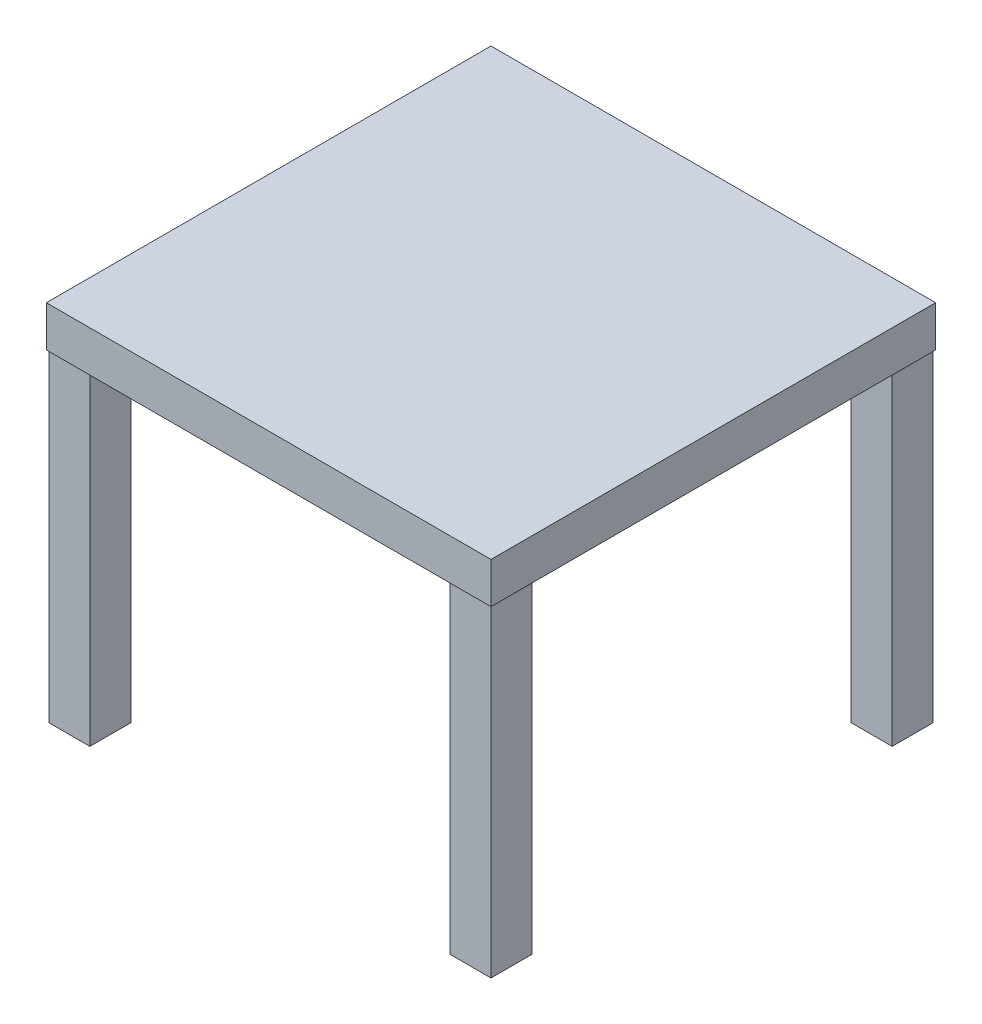
ISO-10303-21;
HEADER;
FILE_DESCRIPTION(('STEP AP214'),'2;1');
FILE_NAME('part.step','',(''),(''),'','','');
FILE_SCHEMA(('AUTOMOTIVE_DESIGN { 1 0 10303 214 1 1 1 1 }'));
ENDSEC;
DATA;
#1=APPLICATION_CONTEXT('core data for automotive mechanical design processes');
#2=APPLICATION_PROTOCOL_DEFINITION('international standard','automotive_design',2000,#1);
#3=PRODUCT_CONTEXT('',#1,'mechanical');
#4=PRODUCT('Part','Part','',(#3));
#5=PRODUCT_RELATED_PRODUCT_CATEGORY('part','',(#4));
#6=PRODUCT_DEFINITION_FORMATION('','',#4);
#7=PRODUCT_DEFINITION_CONTEXT('part definition',#1,'design');
#8=PRODUCT_DEFINITION('design','',#6,#7);
#9=PRODUCT_DEFINITION_SHAPE('','',#8);
#10=(LENGTH_UNIT() NAMED_UNIT(*) SI_UNIT(.MILLI.,.METRE.));
#11=(NAMED_UNIT(*) PLANE_ANGLE_UNIT() SI_UNIT($,.RADIAN.));
#12=(NAMED_UNIT(*) SI_UNIT($,.STERADIAN.) SOLID_ANGLE_UNIT());
#13=UNCERTAINTY_MEASURE_WITH_UNIT(LENGTH_MEASURE(1.E-05),#10,'distance_accuracy_value','');
#14=(GEOMETRIC_REPRESENTATION_CONTEXT(3) GLOBAL_UNCERTAINTY_ASSIGNED_CONTEXT((#13)) GLOBAL_UNIT_ASSIGNED_CONTEXT((#10,
#11,#12)) REPRESENTATION_CONTEXT('',''));
#15=CARTESIAN_POINT('',(0.,0.,0.));
#16=DIRECTION('',(0.,0.,1.));
#17=DIRECTION('',(1.,0.,0.));
#18=AXIS2_PLACEMENT_3D('',#15,#16,#17);
#19=CARTESIAN_POINT('',(0.,0.,0.));
#20=DIRECTION('',(0.,1.,0.));
#21=DIRECTION('',(0.,0.,1.));
#22=AXIS2_PLACEMENT_3D('',#19,#20,#21);
#23=PLANE('',#22);
#24=DIRECTION('',(0.,0.,-1.));
#25=VECTOR('',#24,1.);
#26=CARTESIAN_POINT('',(-273.4,0.,273.400000000001));
#27=LINE('',#26,#25);
#28=CARTESIAN_POINT('',(-273.4,0.,273.400000000001));
#29=VERTEX_POINT('',#28);
#30=CARTESIAN_POINT('',(-273.4,0.,222.800000000001));
#31=VERTEX_POINT('',#30);
#32=EDGE_CURVE('E191',#29,#31,#27,.T.);
#33=ORIENTED_EDGE('',*,*,#32,.F.);
#34=DIRECTION('',(-1.,0.,0.));
#35=VECTOR('',#34,1.);
#36=CARTESIAN_POINT('',(-273.4,0.,273.400000000001));
#37=LINE('',#36,#35);
#38=CARTESIAN_POINT('',(-222.8,0.,273.400000000001));
#39=VERTEX_POINT('',#38);
#40=EDGE_CURVE('E204',#39,#29,#37,.T.);
#41=ORIENTED_EDGE('',*,*,#40,.F.);
#42=DIRECTION('',(0.,0.,1.));
#43=VECTOR('',#42,1.);
#44=CARTESIAN_POINT('',(-222.8,0.,273.400000000001));
#45=LINE('',#44,#43);
#46=CARTESIAN_POINT('',(-222.8,0.,222.800000000001));
#47=VERTEX_POINT('',#46);
#48=EDGE_CURVE('E213',#47,#39,#45,.T.);
#49=ORIENTED_EDGE('',*,*,#48,.F.);
#50=DIRECTION('',(1.,0.,0.));
#51=VECTOR('',#50,1.);
#52=CARTESIAN_POINT('',(-273.4,0.,222.800000000001));
#53=LINE('',#52,#51);
#54=EDGE_CURVE('E194',#31,#47,#53,.T.);
#55=ORIENTED_EDGE('',*,*,#54,.F.);
#56=EDGE_LOOP('',(#33,#41,#49,#55));
#57=FACE_BOUND('',#56,.T.);
#58=DIRECTION('',(0.,0.,1.));
#59=VECTOR('',#58,1.);
#60=CARTESIAN_POINT('',(273.4,0.,-273.4));
#61=LINE('',#60,#59);
#62=CARTESIAN_POINT('',(273.4,0.,-273.4));
#63=VERTEX_POINT('',#62);
#64=CARTESIAN_POINT('',(273.4,0.,-222.8));
#65=VERTEX_POINT('',#64);
#66=EDGE_CURVE('E262',#63,#65,#61,.T.);
#67=ORIENTED_EDGE('',*,*,#66,.F.);
#68=DIRECTION('',(1.,0.,0.));
#69=VECTOR('',#68,1.);
#70=CARTESIAN_POINT('',(273.4,0.,-273.4));
#71=LINE('',#70,#69);
#72=CARTESIAN_POINT('',(222.8,0.,-273.4));
#73=VERTEX_POINT('',#72);
#74=EDGE_CURVE('E267',#73,#63,#71,.T.);
#75=ORIENTED_EDGE('',*,*,#74,.F.);
#76=DIRECTION('',(0.,0.,-1.));
#77=VECTOR('',#76,1.);
#78=CARTESIAN_POINT('',(222.8,0.,-273.4));
#79=LINE('',#78,#77);
#80=CARTESIAN_POINT('',(222.8,0.,-222.8));
#81=VERTEX_POINT('',#80);
#82=EDGE_CURVE('E279',#81,#73,#79,.T.);
#83=ORIENTED_EDGE('',*,*,#82,.F.);
#84=DIRECTION('',(-1.,0.,0.));
#85=VECTOR('',#84,1.);
#86=CARTESIAN_POINT('',(273.4,0.,-222.8));
#87=LINE('',#86,#85);
#88=EDGE_CURVE('E276',#65,#81,#87,.T.);
#89=ORIENTED_EDGE('',*,*,#88,.F.);
#90=EDGE_LOOP('',(#67,#75,#83,#89));
#91=FACE_BOUND('',#90,.T.);
#92=DIRECTION('',(0.,0.,1.));
#93=VECTOR('',#92,1.);
#94=CARTESIAN_POINT('',(-275.,0.,-275.));
#95=LINE('',#94,#93);
#96=CARTESIAN_POINT('',(-275.,0.,-275.));
#97=VERTEX_POINT('',#96);
#98=CARTESIAN_POINT('',(-275.,0.,275.000000000001));
#99=VERTEX_POINT('',#98);
#100=EDGE_CURVE('E295',#97,#99,#95,.T.);
#101=ORIENTED_EDGE('',*,*,#100,.F.);
#102=DIRECTION('',(-1.,0.,0.));
#103=VECTOR('',#102,1.);
#104=CARTESIAN_POINT('',(-275.,0.,-275.));
#105=LINE('',#104,#103);
#106=CARTESIAN_POINT('',(275.,0.,-275.));
#107=VERTEX_POINT('',#106);
#108=EDGE_CURVE('E300',#107,#97,#105,.T.);
#109=ORIENTED_EDGE('',*,*,#108,.F.);
#110=DIRECTION('',(0.,0.,-1.));
#111=VECTOR('',#110,1.);
#112=CARTESIAN_POINT('',(275.,0.,-275.));
#113=LINE('',#112,#111);
#114=CARTESIAN_POINT('',(275.,0.,275.000000000001));
#115=VERTEX_POINT('',#114);
#116=EDGE_CURVE('E311',#115,#107,#113,.T.);
#117=ORIENTED_EDGE('',*,*,#116,.F.);
#118=DIRECTION('',(1.,0.,0.));
#119=VECTOR('',#118,1.);
#120=CARTESIAN_POINT('',(-275.,0.,275.000000000001));
#121=LINE('',#120,#119);
#122=EDGE_CURVE('E309',#99,#115,#121,.T.);
#123=ORIENTED_EDGE('',*,*,#122,.F.);
#124=EDGE_LOOP('',(#101,#109,#117,#123));
#125=FACE_BOUND('',#124,.T.);
#126=DIRECTION('',(0.,0.,-1.));
#127=VECTOR('',#126,1.);
#128=CARTESIAN_POINT('',(-273.4,0.,-273.4));
#129=LINE('',#128,#127);
#130=CARTESIAN_POINT('',(-273.4,0.,-222.8));
#131=VERTEX_POINT('',#130);
#132=CARTESIAN_POINT('',(-273.4,0.,-273.4));
#133=VERTEX_POINT('',#132);
#134=EDGE_CURVE('E229',#131,#133,#129,.T.);
#135=ORIENTED_EDGE('',*,*,#134,.F.);
#136=DIRECTION('',(-1.,0.,0.));
#137=VECTOR('',#136,1.);
#138=CARTESIAN_POINT('',(-273.4,0.,-222.8));
#139=LINE('',#138,#137);
#140=CARTESIAN_POINT('',(-222.8,0.,-222.8));
#141=VERTEX_POINT('',#140);
#142=EDGE_CURVE('E234',#141,#131,#139,.T.);
#143=ORIENTED_EDGE('',*,*,#142,.F.);
#144=DIRECTION('',(0.,0.,1.));
#145=VECTOR('',#144,1.);
#146=CARTESIAN_POINT('',(-222.8,0.,-273.4));
#147=LINE('',#146,#145);
#148=CARTESIAN_POINT('',(-222.8,0.,-273.4));
#149=VERTEX_POINT('',#148);
#150=EDGE_CURVE('E246',#149,#141,#147,.T.);
#151=ORIENTED_EDGE('',*,*,#150,.F.);
#152=DIRECTION('',(1.,0.,0.));
#153=VECTOR('',#152,1.);
#154=CARTESIAN_POINT('',(-273.4,0.,-273.4));
#155=LINE('',#154,#153);
#156=EDGE_CURVE('E243',#133,#149,#155,.T.);
#157=ORIENTED_EDGE('',*,*,#156,.F.);
#158=EDGE_LOOP('',(#135,#143,#151,#157));
#159=FACE_BOUND('',#158,.T.);
#160=DIRECTION('',(0.,0.,-1.));
#161=VECTOR('',#160,1.);
#162=CARTESIAN_POINT('',(222.8,0.,222.800000000001));
#163=LINE('',#162,#161);
#164=CARTESIAN_POINT('',(222.8,0.,273.400000000001));
#165=VERTEX_POINT('',#164);
#166=CARTESIAN_POINT('',(222.8,0.,222.800000000001));
#167=VERTEX_POINT('',#166);
#168=EDGE_CURVE('E190',#165,#167,#163,.T.);
#169=ORIENTED_EDGE('',*,*,#168,.F.);
#170=DIRECTION('',(-1.,0.,0.));
#171=VECTOR('',#170,1.);
#172=CARTESIAN_POINT('',(222.8,0.,273.400000000001));
#173=LINE('',#172,#171);
#174=CARTESIAN_POINT('',(273.4,0.,273.400000000001));
#175=VERTEX_POINT('',#174);
#176=EDGE_CURVE('E187',#175,#165,#173,.T.);
#177=ORIENTED_EDGE('',*,*,#176,.F.);
#178=DIRECTION('',(0.,0.,1.));
#179=VECTOR('',#178,1.);
#180=CARTESIAN_POINT('',(273.4,0.,222.800000000001));
#181=LINE('',#180,#179);
#182=CARTESIAN_POINT('',(273.4,0.,222.800000000001));
#183=VERTEX_POINT('',#182);
#184=EDGE_CURVE('E53',#183,#175,#181,.T.);
#185=ORIENTED_EDGE('',*,*,#184,.F.);
#186=DIRECTION('',(1.,0.,0.));
#187=VECTOR('',#186,1.);
#188=CARTESIAN_POINT('',(222.8,0.,222.800000000001));
#189=LINE('',#188,#187);
#190=EDGE_CURVE('E48',#167,#183,#189,.T.);
#191=ORIENTED_EDGE('',*,*,#190,.F.);
#192=EDGE_LOOP('',(#169,#177,#185,#191));
#193=FACE_BOUND('',#192,.T.);
#194=ADVANCED_FACE('F33',(#57,#91,#125,#159,#193),#23,.F.);
#195=CARTESIAN_POINT('',(-275.,50.6,-275.));
#196=DIRECTION('',(1.,0.,0.));
#197=DIRECTION('',(0.,0.,-1.));
#198=AXIS2_PLACEMENT_3D('',#195,#196,#197);
#199=PLANE('',#198);
#200=ORIENTED_EDGE('',*,*,#100,.T.);
#201=DIRECTION('',(0.,-1.,0.));
#202=VECTOR('',#201,1.);
#203=CARTESIAN_POINT('',(-275.,50.6,275.000000000001));
#204=LINE('',#203,#202);
#205=CARTESIAN_POINT('',(-275.,50.6,275.000000000001));
#206=VERTEX_POINT('',#205);
#207=EDGE_CURVE('E11',#206,#99,#204,.T.);
#208=ORIENTED_EDGE('',*,*,#207,.F.);
#209=DIRECTION('',(0.,0.,1.));
#210=VECTOR('',#209,1.);
#211=CARTESIAN_POINT('',(-275.,50.6,-275.));
#212=LINE('',#211,#210);
#213=CARTESIAN_POINT('',(-275.,50.6,-275.));
#214=VERTEX_POINT('',#213);
#215=EDGE_CURVE('E296',#214,#206,#212,.T.);
#216=ORIENTED_EDGE('',*,*,#215,.F.);
#217=DIRECTION('',(0.,-1.,0.));
#218=VECTOR('',#217,1.);
#219=CARTESIAN_POINT('',(-275.,50.6,-275.));
#220=LINE('',#219,#218);
#221=EDGE_CURVE('E306',#214,#97,#220,.T.);
#222=ORIENTED_EDGE('',*,*,#221,.T.);
#223=EDGE_LOOP('',(#200,#208,#216,#222));
#224=FACE_BOUND('',#223,.T.);
#225=ADVANCED_FACE('F35',(#224),#199,.F.);
#226=CARTESIAN_POINT('',(-275.,50.6,275.000000000001));
#227=DIRECTION('',(0.,0.,-1.));
#228=DIRECTION('',(-1.,0.,0.));
#229=AXIS2_PLACEMENT_3D('',#226,#227,#228);
#230=PLANE('',#229);
#231=ORIENTED_EDGE('',*,*,#122,.T.);
#232=DIRECTION('',(0.,-1.,0.));
#233=VECTOR('',#232,1.);
#234=CARTESIAN_POINT('',(275.,50.6,275.000000000001));
#235=LINE('',#234,#233);
#236=CARTESIAN_POINT('',(275.,50.6,275.000000000001));
#237=VERTEX_POINT('',#236);
#238=EDGE_CURVE('E41',#237,#115,#235,.T.);
#239=ORIENTED_EDGE('',*,*,#238,.F.);
#240=DIRECTION('',(1.,0.,0.));
#241=VECTOR('',#240,1.);
#242=CARTESIAN_POINT('',(-275.,50.6,275.000000000001));
#243=LINE('',#242,#241);
#244=EDGE_CURVE('E299',#206,#237,#243,.T.);
#245=ORIENTED_EDGE('',*,*,#244,.F.);
#246=ORIENTED_EDGE('',*,*,#207,.T.);
#247=EDGE_LOOP('',(#231,#239,#245,#246));
#248=FACE_BOUND('',#247,.T.);
#249=ADVANCED_FACE('F339',(#248),#230,.F.);
#250=CARTESIAN_POINT('',(275.,50.6,-275.));
#251=DIRECTION('',(-1.,0.,0.));
#252=DIRECTION('',(0.,0.,1.));
#253=AXIS2_PLACEMENT_3D('',#250,#251,#252);
#254=PLANE('',#253);
#255=ORIENTED_EDGE('',*,*,#116,.T.);
#256=DIRECTION('',(0.,-1.,0.));
#257=VECTOR('',#256,1.);
#258=CARTESIAN_POINT('',(275.,50.6,-275.));
#259=LINE('',#258,#257);
#260=CARTESIAN_POINT('',(275.,50.6,-275.));
#261=VERTEX_POINT('',#260);
#262=EDGE_CURVE('E316',#261,#107,#259,.T.);
#263=ORIENTED_EDGE('',*,*,#262,.F.);
#264=DIRECTION('',(0.,0.,-1.));
#265=VECTOR('',#264,1.);
#266=CARTESIAN_POINT('',(275.,50.6,-275.));
#267=LINE('',#266,#265);
#268=EDGE_CURVE('E302',#237,#261,#267,.T.);
#269=ORIENTED_EDGE('',*,*,#268,.F.);
#270=ORIENTED_EDGE('',*,*,#238,.T.);
#271=EDGE_LOOP('',(#255,#263,#269,#270));
#272=FACE_BOUND('',#271,.T.);
#273=ADVANCED_FACE('F323',(#272),#254,.F.);
#274=CARTESIAN_POINT('',(-275.,50.6,-275.));
#275=DIRECTION('',(0.,0.,1.));
#276=DIRECTION('',(1.,0.,0.));
#277=AXIS2_PLACEMENT_3D('',#274,#275,#276);
#278=PLANE('',#277);
#279=ORIENTED_EDGE('',*,*,#108,.T.);
#280=ORIENTED_EDGE('',*,*,#221,.F.);
#281=DIRECTION('',(-1.,0.,0.));
#282=VECTOR('',#281,1.);
#283=CARTESIAN_POINT('',(-275.,50.6,-275.));
#284=LINE('',#283,#282);
#285=EDGE_CURVE('E304',#261,#214,#284,.T.);
#286=ORIENTED_EDGE('',*,*,#285,.F.);
#287=ORIENTED_EDGE('',*,*,#262,.T.);
#288=EDGE_LOOP('',(#279,#280,#286,#287));
#289=FACE_BOUND('',#288,.T.);
#290=ADVANCED_FACE('F332',(#289),#278,.F.);
#291=CARTESIAN_POINT('',(0.,50.6,0.));
#292=DIRECTION('',(0.,1.,0.));
#293=DIRECTION('',(0.,0.,1.));
#294=AXIS2_PLACEMENT_3D('',#291,#292,#293);
#295=PLANE('',#294);
#296=ORIENTED_EDGE('',*,*,#215,.T.);
#297=ORIENTED_EDGE('',*,*,#244,.T.);
#298=ORIENTED_EDGE('',*,*,#268,.T.);
#299=ORIENTED_EDGE('',*,*,#285,.T.);
#300=EDGE_LOOP('',(#296,#297,#298,#299));
#301=FACE_BOUND('',#300,.T.);
#302=ADVANCED_FACE('F338',(#301),#295,.T.);
#303=CARTESIAN_POINT('',(273.4,-399.4,-273.4));
#304=DIRECTION('',(-1.,0.,0.));
#305=DIRECTION('',(0.,0.,1.));
#306=AXIS2_PLACEMENT_3D('',#303,#304,#305);
#307=PLANE('',#306);
#308=ORIENTED_EDGE('',*,*,#66,.T.);
#309=DIRECTION('',(0.,1.,0.));
#310=VECTOR('',#309,1.);
#311=CARTESIAN_POINT('',(273.4,-399.4,-222.8));
#312=LINE('',#311,#310);
#313=CARTESIAN_POINT('',(273.4,-399.4,-222.8));
#314=VERTEX_POINT('',#313);
#315=EDGE_CURVE('E292',#314,#65,#312,.T.);
#316=ORIENTED_EDGE('',*,*,#315,.F.);
#317=DIRECTION('',(0.,0.,1.));
#318=VECTOR('',#317,1.);
#319=CARTESIAN_POINT('',(273.4,-399.4,-273.4));
#320=LINE('',#319,#318);
#321=CARTESIAN_POINT('',(273.4,-399.4,-273.4));
#322=VERTEX_POINT('',#321);
#323=EDGE_CURVE('E263',#322,#314,#320,.T.);
#324=ORIENTED_EDGE('',*,*,#323,.F.);
#325=DIRECTION('',(0.,1.,0.));
#326=VECTOR('',#325,1.);
#327=CARTESIAN_POINT('',(273.4,-399.4,-273.4));
#328=LINE('',#327,#326);
#329=EDGE_CURVE('E273',#322,#63,#328,.T.);
#330=ORIENTED_EDGE('',*,*,#329,.T.);
#331=EDGE_LOOP('',(#308,#316,#324,#330));
#332=FACE_BOUND('',#331,.T.);
#333=ADVANCED_FACE('F359',(#332),#307,.F.);
#334=CARTESIAN_POINT('',(273.4,-399.4,-222.8));
#335=DIRECTION('',(0.,0.,-1.));
#336=DIRECTION('',(-1.,0.,0.));
#337=AXIS2_PLACEMENT_3D('',#334,#335,#336);
#338=PLANE('',#337);
#339=ORIENTED_EDGE('',*,*,#88,.T.);
#340=DIRECTION('',(0.,1.,0.));
#341=VECTOR('',#340,1.);
#342=CARTESIAN_POINT('',(222.8,-399.4,-222.8));
#343=LINE('',#342,#341);
#344=CARTESIAN_POINT('',(222.8,-399.4,-222.8));
#345=VERTEX_POINT('',#344);
#346=EDGE_CURVE('E289',#345,#81,#343,.T.);
#347=ORIENTED_EDGE('',*,*,#346,.F.);
#348=DIRECTION('',(-1.,0.,0.));
#349=VECTOR('',#348,1.);
#350=CARTESIAN_POINT('',(273.4,-399.4,-222.8));
#351=LINE('',#350,#349);
#352=EDGE_CURVE('E266',#314,#345,#351,.T.);
#353=ORIENTED_EDGE('',*,*,#352,.F.);
#354=ORIENTED_EDGE('',*,*,#315,.T.);
#355=EDGE_LOOP('',(#339,#347,#353,#354));
#356=FACE_BOUND('',#355,.T.);
#357=ADVANCED_FACE('F363',(#356),#338,.F.);
#358=CARTESIAN_POINT('',(222.8,-399.4,-273.4));
#359=DIRECTION('',(1.,0.,0.));
#360=DIRECTION('',(0.,0.,-1.));
#361=AXIS2_PLACEMENT_3D('',#358,#359,#360);
#362=PLANE('',#361);
#363=ORIENTED_EDGE('',*,*,#82,.T.);
#364=DIRECTION('',(0.,1.,0.));
#365=VECTOR('',#364,1.);
#366=CARTESIAN_POINT('',(222.8,-399.4,-273.4));
#367=LINE('',#366,#365);
#368=CARTESIAN_POINT('',(222.8,-399.4,-273.4));
#369=VERTEX_POINT('',#368);
#370=EDGE_CURVE('E286',#369,#73,#367,.T.);
#371=ORIENTED_EDGE('',*,*,#370,.F.);
#372=DIRECTION('',(0.,0.,-1.));
#373=VECTOR('',#372,1.);
#374=CARTESIAN_POINT('',(222.8,-399.4,-273.4));
#375=LINE('',#374,#373);
#376=EDGE_CURVE('E269',#345,#369,#375,.T.);
#377=ORIENTED_EDGE('',*,*,#376,.F.);
#378=ORIENTED_EDGE('',*,*,#346,.T.);
#379=EDGE_LOOP('',(#363,#371,#377,#378));
#380=FACE_BOUND('',#379,.T.);
#381=ADVANCED_FACE('F368',(#380),#362,.F.);
#382=CARTESIAN_POINT('',(273.4,-399.4,-273.4));
#383=DIRECTION('',(0.,0.,1.));
#384=DIRECTION('',(1.,0.,0.));
#385=AXIS2_PLACEMENT_3D('',#382,#383,#384);
#386=PLANE('',#385);
#387=ORIENTED_EDGE('',*,*,#74,.T.);
#388=ORIENTED_EDGE('',*,*,#329,.F.);
#389=DIRECTION('',(1.,0.,0.));
#390=VECTOR('',#389,1.);
#391=CARTESIAN_POINT('',(273.4,-399.4,-273.4));
#392=LINE('',#391,#390);
#393=EDGE_CURVE('E271',#369,#322,#392,.T.);
#394=ORIENTED_EDGE('',*,*,#393,.F.);
#395=ORIENTED_EDGE('',*,*,#370,.T.);
#396=EDGE_LOOP('',(#387,#388,#394,#395));
#397=FACE_BOUND('',#396,.T.);
#398=ADVANCED_FACE('F374',(#397),#386,.F.);
#399=CARTESIAN_POINT('',(0.,-399.4,0.));
#400=DIRECTION('',(0.,-1.,0.));
#401=DIRECTION('',(0.,0.,-1.));
#402=AXIS2_PLACEMENT_3D('',#399,#400,#401);
#403=PLANE('',#402);
#404=ORIENTED_EDGE('',*,*,#323,.T.);
#405=ORIENTED_EDGE('',*,*,#352,.T.);
#406=ORIENTED_EDGE('',*,*,#376,.T.);
#407=ORIENTED_EDGE('',*,*,#393,.T.);
#408=EDGE_LOOP('',(#404,#405,#406,#407));
#409=FACE_BOUND('',#408,.T.);
#410=ADVANCED_FACE('F378',(#409),#403,.T.);
#411=CARTESIAN_POINT('',(-273.4,-399.4,-273.4));
#412=DIRECTION('',(1.,0.,0.));
#413=DIRECTION('',(0.,0.,-1.));
#414=AXIS2_PLACEMENT_3D('',#411,#412,#413);
#415=PLANE('',#414);
#416=ORIENTED_EDGE('',*,*,#134,.T.);
#417=DIRECTION('',(0.,1.,0.));
#418=VECTOR('',#417,1.);
#419=CARTESIAN_POINT('',(-273.4,-399.4,-273.4));
#420=LINE('',#419,#418);
#421=CARTESIAN_POINT('',(-273.4,-399.4,-273.4));
#422=VERTEX_POINT('',#421);
#423=EDGE_CURVE('E259',#422,#133,#420,.T.);
#424=ORIENTED_EDGE('',*,*,#423,.F.);
#425=DIRECTION('',(0.,0.,-1.));
#426=VECTOR('',#425,1.);
#427=CARTESIAN_POINT('',(-273.4,-399.4,-273.4));
#428=LINE('',#427,#426);
#429=CARTESIAN_POINT('',(-273.4,-399.4,-222.8));
#430=VERTEX_POINT('',#429);
#431=EDGE_CURVE('E230',#430,#422,#428,.T.);
#432=ORIENTED_EDGE('',*,*,#431,.F.);
#433=DIRECTION('',(0.,1.,0.));
#434=VECTOR('',#433,1.);
#435=CARTESIAN_POINT('',(-273.4,-399.4,-222.8));
#436=LINE('',#435,#434);
#437=EDGE_CURVE('E240',#430,#131,#436,.T.);
#438=ORIENTED_EDGE('',*,*,#437,.T.);
#439=EDGE_LOOP('',(#416,#424,#432,#438));
#440=FACE_BOUND('',#439,.T.);
#441=ADVANCED_FACE('F382',(#440),#415,.F.);
#442=CARTESIAN_POINT('',(-273.4,-399.4,-273.4));
#443=DIRECTION('',(0.,0.,1.));
#444=DIRECTION('',(1.,0.,0.));
#445=AXIS2_PLACEMENT_3D('',#442,#443,#444);
#446=PLANE('',#445);
#447=ORIENTED_EDGE('',*,*,#156,.T.);
#448=DIRECTION('',(0.,1.,0.));
#449=VECTOR('',#448,1.);
#450=CARTESIAN_POINT('',(-222.8,-399.4,-273.4));
#451=LINE('',#450,#449);
#452=CARTESIAN_POINT('',(-222.8,-399.4,-273.4));
#453=VERTEX_POINT('',#452);
#454=EDGE_CURVE('E256',#453,#149,#451,.T.);
#455=ORIENTED_EDGE('',*,*,#454,.F.);
#456=DIRECTION('',(1.,0.,0.));
#457=VECTOR('',#456,1.);
#458=CARTESIAN_POINT('',(-273.4,-399.4,-273.4));
#459=LINE('',#458,#457);
#460=EDGE_CURVE('E233',#422,#453,#459,.T.);
#461=ORIENTED_EDGE('',*,*,#460,.F.);
#462=ORIENTED_EDGE('',*,*,#423,.T.);
#463=EDGE_LOOP('',(#447,#455,#461,#462));
#464=FACE_BOUND('',#463,.T.);
#465=ADVANCED_FACE('F386',(#464),#446,.F.);
#466=CARTESIAN_POINT('',(-222.8,-399.4,-273.4));
#467=DIRECTION('',(-1.,0.,0.));
#468=DIRECTION('',(0.,0.,1.));
#469=AXIS2_PLACEMENT_3D('',#466,#467,#468);
#470=PLANE('',#469);
#471=ORIENTED_EDGE('',*,*,#150,.T.);
#472=DIRECTION('',(0.,1.,0.));
#473=VECTOR('',#472,1.);
#474=CARTESIAN_POINT('',(-222.8,-399.4,-222.8));
#475=LINE('',#474,#473);
#476=CARTESIAN_POINT('',(-222.8,-399.4,-222.8));
#477=VERTEX_POINT('',#476);
#478=EDGE_CURVE('E253',#477,#141,#475,.T.);
#479=ORIENTED_EDGE('',*,*,#478,.F.);
#480=DIRECTION('',(0.,0.,1.));
#481=VECTOR('',#480,1.);
#482=CARTESIAN_POINT('',(-222.8,-399.4,-273.4));
#483=LINE('',#482,#481);
#484=EDGE_CURVE('E236',#453,#477,#483,.T.);
#485=ORIENTED_EDGE('',*,*,#484,.F.);
#486=ORIENTED_EDGE('',*,*,#454,.T.);
#487=EDGE_LOOP('',(#471,#479,#485,#486));
#488=FACE_BOUND('',#487,.T.);
#489=ADVANCED_FACE('F390',(#488),#470,.F.);
#490=CARTESIAN_POINT('',(-273.4,-399.4,-222.8));
#491=DIRECTION('',(0.,0.,-1.));
#492=DIRECTION('',(-1.,0.,0.));
#493=AXIS2_PLACEMENT_3D('',#490,#491,#492);
#494=PLANE('',#493);
#495=ORIENTED_EDGE('',*,*,#142,.T.);
#496=ORIENTED_EDGE('',*,*,#437,.F.);
#497=DIRECTION('',(-1.,0.,0.));
#498=VECTOR('',#497,1.);
#499=CARTESIAN_POINT('',(-273.4,-399.4,-222.8));
#500=LINE('',#499,#498);
#501=EDGE_CURVE('E238',#477,#430,#500,.T.);
#502=ORIENTED_EDGE('',*,*,#501,.F.);
#503=ORIENTED_EDGE('',*,*,#478,.T.);
#504=EDGE_LOOP('',(#495,#496,#502,#503));
#505=FACE_BOUND('',#504,.T.);
#506=ADVANCED_FACE('F394',(#505),#494,.F.);
#507=CARTESIAN_POINT('',(0.,-399.4,0.));
#508=DIRECTION('',(0.,1.,0.));
#509=DIRECTION('',(0.,0.,1.));
#510=AXIS2_PLACEMENT_3D('',#507,#508,#509);
#511=PLANE('',#510);
#512=ORIENTED_EDGE('',*,*,#431,.T.);
#513=ORIENTED_EDGE('',*,*,#460,.T.);
#514=ORIENTED_EDGE('',*,*,#484,.T.);
#515=ORIENTED_EDGE('',*,*,#501,.T.);
#516=EDGE_LOOP('',(#512,#513,#514,#515));
#517=FACE_BOUND('',#516,.T.);
#518=ADVANCED_FACE('F398',(#517),#511,.F.);
#519=CARTESIAN_POINT('',(-273.4,-399.4,273.400000000001));
#520=DIRECTION('',(1.,0.,0.));
#521=DIRECTION('',(0.,0.,-1.));
#522=AXIS2_PLACEMENT_3D('',#519,#520,#521);
#523=PLANE('',#522);
#524=ORIENTED_EDGE('',*,*,#32,.T.);
#525=DIRECTION('',(0.,1.,0.));
#526=VECTOR('',#525,1.);
#527=CARTESIAN_POINT('',(-273.4,-399.4,222.800000000001));
#528=LINE('',#527,#526);
#529=CARTESIAN_POINT('',(-273.4,-399.4,222.800000000001));
#530=VERTEX_POINT('',#529);
#531=EDGE_CURVE('E226',#530,#31,#528,.T.);
#532=ORIENTED_EDGE('',*,*,#531,.F.);
#533=DIRECTION('',(0.,0.,-1.));
#534=VECTOR('',#533,1.);
#535=CARTESIAN_POINT('',(-273.4,-399.4,273.400000000001));
#536=LINE('',#535,#534);
#537=CARTESIAN_POINT('',(-273.4,-399.4,273.400000000001));
#538=VERTEX_POINT('',#537);
#539=EDGE_CURVE('E200',#538,#530,#536,.T.);
#540=ORIENTED_EDGE('',*,*,#539,.F.);
#541=DIRECTION('',(0.,1.,0.));
#542=VECTOR('',#541,1.);
#543=CARTESIAN_POINT('',(-273.4,-399.4,273.400000000001));
#544=LINE('',#543,#542);
#545=EDGE_CURVE('E209',#538,#29,#544,.T.);
#546=ORIENTED_EDGE('',*,*,#545,.T.);
#547=EDGE_LOOP('',(#524,#532,#540,#546));
#548=FACE_BOUND('',#547,.T.);
#549=ADVANCED_FACE('F402',(#548),#523,.F.);
#550=CARTESIAN_POINT('',(-273.4,-399.4,222.800000000001));
#551=DIRECTION('',(0.,0.,1.));
#552=DIRECTION('',(1.,0.,0.));
#553=AXIS2_PLACEMENT_3D('',#550,#551,#552);
#554=PLANE('',#553);
#555=ORIENTED_EDGE('',*,*,#54,.T.);
#556=DIRECTION('',(0.,1.,0.));
#557=VECTOR('',#556,1.);
#558=CARTESIAN_POINT('',(-222.8,-399.4,222.800000000001));
#559=LINE('',#558,#557);
#560=CARTESIAN_POINT('',(-222.8,-399.4,222.800000000001));
#561=VERTEX_POINT('',#560);
#562=EDGE_CURVE('E223',#561,#47,#559,.T.);
#563=ORIENTED_EDGE('',*,*,#562,.F.);
#564=DIRECTION('',(1.,0.,0.));
#565=VECTOR('',#564,1.);
#566=CARTESIAN_POINT('',(-273.4,-399.4,222.800000000001));
#567=LINE('',#566,#565);
#568=EDGE_CURVE('E203',#530,#561,#567,.T.);
#569=ORIENTED_EDGE('',*,*,#568,.F.);
#570=ORIENTED_EDGE('',*,*,#531,.T.);
#571=EDGE_LOOP('',(#555,#563,#569,#570));
#572=FACE_BOUND('',#571,.T.);
#573=ADVANCED_FACE('F406',(#572),#554,.F.);
#574=CARTESIAN_POINT('',(-222.8,-399.4,273.400000000001));
#575=DIRECTION('',(-1.,0.,0.));
#576=DIRECTION('',(0.,0.,1.));
#577=AXIS2_PLACEMENT_3D('',#574,#575,#576);
#578=PLANE('',#577);
#579=ORIENTED_EDGE('',*,*,#48,.T.);
#580=DIRECTION('',(0.,1.,0.));
#581=VECTOR('',#580,1.);
#582=CARTESIAN_POINT('',(-222.8,-399.4,273.400000000001));
#583=LINE('',#582,#581);
#584=CARTESIAN_POINT('',(-222.8,-399.4,273.400000000001));
#585=VERTEX_POINT('',#584);
#586=EDGE_CURVE('E220',#585,#39,#583,.T.);
#587=ORIENTED_EDGE('',*,*,#586,.F.);
#588=DIRECTION('',(0.,0.,1.));
#589=VECTOR('',#588,1.);
#590=CARTESIAN_POINT('',(-222.8,-399.4,273.400000000001));
#591=LINE('',#590,#589);
#592=EDGE_CURVE('E206',#561,#585,#591,.T.);
#593=ORIENTED_EDGE('',*,*,#592,.F.);
#594=ORIENTED_EDGE('',*,*,#562,.T.);
#595=EDGE_LOOP('',(#579,#587,#593,#594));
#596=FACE_BOUND('',#595,.T.);
#597=ADVANCED_FACE('F410',(#596),#578,.F.);
#598=CARTESIAN_POINT('',(-273.4,-399.4,273.400000000001));
#599=DIRECTION('',(0.,0.,-1.));
#600=DIRECTION('',(-1.,0.,0.));
#601=AXIS2_PLACEMENT_3D('',#598,#599,#600);
#602=PLANE('',#601);
#603=ORIENTED_EDGE('',*,*,#40,.T.);
#604=ORIENTED_EDGE('',*,*,#545,.F.);
#605=DIRECTION('',(-1.,0.,0.));
#606=VECTOR('',#605,1.);
#607=CARTESIAN_POINT('',(-273.4,-399.4,273.400000000001));
#608=LINE('',#607,#606);
#609=EDGE_CURVE('E208',#585,#538,#608,.T.);
#610=ORIENTED_EDGE('',*,*,#609,.F.);
#611=ORIENTED_EDGE('',*,*,#586,.T.);
#612=EDGE_LOOP('',(#603,#604,#610,#611));
#613=FACE_BOUND('',#612,.T.);
#614=ADVANCED_FACE('F414',(#613),#602,.F.);
#615=CARTESIAN_POINT('',(0.,-399.4,0.));
#616=DIRECTION('',(0.,-1.,0.));
#617=DIRECTION('',(0.,0.,-1.));
#618=AXIS2_PLACEMENT_3D('',#615,#616,#617);
#619=PLANE('',#618);
#620=ORIENTED_EDGE('',*,*,#539,.T.);
#621=ORIENTED_EDGE('',*,*,#568,.T.);
#622=ORIENTED_EDGE('',*,*,#592,.T.);
#623=ORIENTED_EDGE('',*,*,#609,.T.);
#624=EDGE_LOOP('',(#620,#621,#622,#623));
#625=FACE_BOUND('',#624,.T.);
#626=ADVANCED_FACE('F418',(#625),#619,.T.);
#627=CARTESIAN_POINT('',(222.8,-399.4,222.800000000001));
#628=DIRECTION('',(1.,0.,0.));
#629=DIRECTION('',(0.,0.,-1.));
#630=AXIS2_PLACEMENT_3D('',#627,#628,#629);
#631=PLANE('',#630);
#632=ORIENTED_EDGE('',*,*,#168,.T.);
#633=DIRECTION('',(0.,1.,0.));
#634=VECTOR('',#633,1.);
#635=CARTESIAN_POINT('',(222.8,-399.4,222.800000000001));
#636=LINE('',#635,#634);
#637=CARTESIAN_POINT('',(222.8,-399.4,222.800000000001));
#638=VERTEX_POINT('',#637);
#639=EDGE_CURVE('E171',#638,#167,#636,.T.);
#640=ORIENTED_EDGE('',*,*,#639,.F.);
#641=DIRECTION('',(0.,0.,-1.));
#642=VECTOR('',#641,1.);
#643=CARTESIAN_POINT('',(222.8,-399.4,222.800000000001));
#644=LINE('',#643,#642);
#645=CARTESIAN_POINT('',(222.8,-399.4,273.400000000001));
#646=VERTEX_POINT('',#645);
#647=EDGE_CURVE('E178',#646,#638,#644,.T.);
#648=ORIENTED_EDGE('',*,*,#647,.F.);
#649=DIRECTION('',(0.,1.,0.));
#650=VECTOR('',#649,1.);
#651=CARTESIAN_POINT('',(222.8,-399.4,273.400000000001));
#652=LINE('',#651,#650);
#653=EDGE_CURVE('E584',#646,#165,#652,.T.);
#654=ORIENTED_EDGE('',*,*,#653,.T.);
#655=EDGE_LOOP('',(#632,#640,#648,#654));
#656=FACE_BOUND('',#655,.T.);
#657=ADVANCED_FACE('F189',(#656),#631,.F.);
#658=CARTESIAN_POINT('',(222.8,-399.4,222.800000000001));
#659=DIRECTION('',(0.,0.,1.));
#660=DIRECTION('',(1.,0.,0.));
#661=AXIS2_PLACEMENT_3D('',#658,#659,#660);
#662=PLANE('',#661);
#663=ORIENTED_EDGE('',*,*,#190,.T.);
#664=DIRECTION('',(0.,1.,0.));
#665=VECTOR('',#664,1.);
#666=CARTESIAN_POINT('',(273.4,-399.4,222.800000000001));
#667=LINE('',#666,#665);
#668=CARTESIAN_POINT('',(273.4,-399.4,222.800000000001));
#669=VERTEX_POINT('',#668);
#670=EDGE_CURVE('E174',#669,#183,#667,.T.);
#671=ORIENTED_EDGE('',*,*,#670,.F.);
#672=DIRECTION('',(1.,0.,0.));
#673=VECTOR('',#672,1.);
#674=CARTESIAN_POINT('',(222.8,-399.4,222.800000000001));
#675=LINE('',#674,#673);
#676=EDGE_CURVE('E167',#638,#669,#675,.T.);
#677=ORIENTED_EDGE('',*,*,#676,.F.);
#678=ORIENTED_EDGE('',*,*,#639,.T.);
#679=EDGE_LOOP('',(#663,#671,#677,#678));
#680=FACE_BOUND('',#679,.T.);
#681=ADVANCED_FACE('F169',(#680),#662,.F.);
#682=CARTESIAN_POINT('',(273.4,-399.4,222.800000000001));
#683=DIRECTION('',(-1.,0.,0.));
#684=DIRECTION('',(0.,0.,1.));
#685=AXIS2_PLACEMENT_3D('',#682,#683,#684);
#686=PLANE('',#685);
#687=ORIENTED_EDGE('',*,*,#184,.T.);
#688=DIRECTION('',(0.,1.,0.));
#689=VECTOR('',#688,1.);
#690=CARTESIAN_POINT('',(273.4,-399.4,273.400000000001));
#691=LINE('',#690,#689);
#692=CARTESIAN_POINT('',(273.4,-399.4,273.400000000001));
#693=VERTEX_POINT('',#692);
#694=EDGE_CURVE('E196',#693,#175,#691,.T.);
#695=ORIENTED_EDGE('',*,*,#694,.F.);
#696=DIRECTION('',(0.,0.,1.));
#697=VECTOR('',#696,1.);
#698=CARTESIAN_POINT('',(273.4,-399.4,222.800000000001));
#699=LINE('',#698,#697);
#700=EDGE_CURVE('E177',#669,#693,#699,.T.);
#701=ORIENTED_EDGE('',*,*,#700,.F.);
#702=ORIENTED_EDGE('',*,*,#670,.T.);
#703=EDGE_LOOP('',(#687,#695,#701,#702));
#704=FACE_BOUND('',#703,.T.);
#705=ADVANCED_FACE('F427',(#704),#686,.F.);
#706=CARTESIAN_POINT('',(222.8,-399.4,273.400000000001));
#707=DIRECTION('',(0.,0.,-1.));
#708=DIRECTION('',(-1.,0.,0.));
#709=AXIS2_PLACEMENT_3D('',#706,#707,#708);
#710=PLANE('',#709);
#711=ORIENTED_EDGE('',*,*,#176,.T.);
#712=ORIENTED_EDGE('',*,*,#653,.F.);
#713=DIRECTION('',(-1.,0.,0.));
#714=VECTOR('',#713,1.);
#715=CARTESIAN_POINT('',(222.8,-399.4,273.400000000001));
#716=LINE('',#715,#714);
#717=EDGE_CURVE('E183',#693,#646,#716,.T.);
#718=ORIENTED_EDGE('',*,*,#717,.F.);
#719=ORIENTED_EDGE('',*,*,#694,.T.);
#720=EDGE_LOOP('',(#711,#712,#718,#719));
#721=FACE_BOUND('',#720,.T.);
#722=ADVANCED_FACE('F430',(#721),#710,.F.);
#723=CARTESIAN_POINT('',(0.,-399.4,0.));
#724=DIRECTION('',(0.,1.,0.));
#725=DIRECTION('',(0.,0.,1.));
#726=AXIS2_PLACEMENT_3D('',#723,#724,#725);
#727=PLANE('',#726);
#728=ORIENTED_EDGE('',*,*,#647,.T.);
#729=ORIENTED_EDGE('',*,*,#676,.T.);
#730=ORIENTED_EDGE('',*,*,#700,.T.);
#731=ORIENTED_EDGE('',*,*,#717,.T.);
#732=EDGE_LOOP('',(#728,#729,#730,#731));
#733=FACE_BOUND('',#732,.T.);
#734=ADVANCED_FACE('F181',(#733),#727,.F.);
#735=CLOSED_SHELL('',(#194,#225,#249,#273,#290,#302,#333,#357,#381,#398,#410,#441,#465,#489,
#506,#518,#549,#573,#597,#614,#626,#657,#681,#705,#722,#734));
#736=MANIFOLD_SOLID_BREP('B2',#735);
#737=ADVANCED_BREP_SHAPE_REPRESENTATION('',(#18,#736),#14);
#738=SHAPE_DEFINITION_REPRESENTATION(#9,#737);
ENDSEC;
END-ISO-10303-21;
